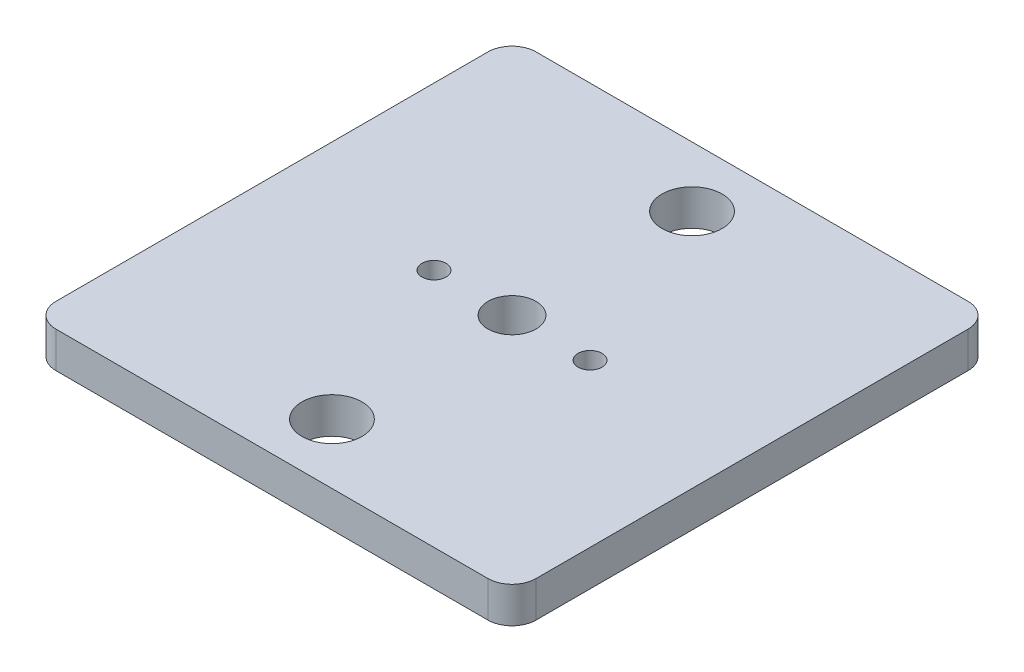
ISO-10303-21;
HEADER;
FILE_DESCRIPTION(('STEP AP214'),'2;1');
FILE_NAME('part.step','',(''),(''),'','','');
FILE_SCHEMA(('AUTOMOTIVE_DESIGN { 1 0 10303 214 1 1 1 1 }'));
ENDSEC;
DATA;
#1=APPLICATION_CONTEXT('core data for automotive mechanical design processes');
#2=APPLICATION_PROTOCOL_DEFINITION('international standard','automotive_design',2000,#1);
#3=PRODUCT_CONTEXT('',#1,'mechanical');
#4=PRODUCT('Part','Part','',(#3));
#5=PRODUCT_RELATED_PRODUCT_CATEGORY('part','',(#4));
#6=PRODUCT_DEFINITION_FORMATION('','',#4);
#7=PRODUCT_DEFINITION_CONTEXT('part definition',#1,'design');
#8=PRODUCT_DEFINITION('design','',#6,#7);
#9=PRODUCT_DEFINITION_SHAPE('','',#8);
#10=(LENGTH_UNIT() NAMED_UNIT(*) SI_UNIT(.MILLI.,.METRE.));
#11=(NAMED_UNIT(*) PLANE_ANGLE_UNIT() SI_UNIT($,.RADIAN.));
#12=(NAMED_UNIT(*) SI_UNIT($,.STERADIAN.) SOLID_ANGLE_UNIT());
#13=UNCERTAINTY_MEASURE_WITH_UNIT(LENGTH_MEASURE(1.E-05),#10,'distance_accuracy_value','');
#14=(GEOMETRIC_REPRESENTATION_CONTEXT(3) GLOBAL_UNCERTAINTY_ASSIGNED_CONTEXT((#13)) GLOBAL_UNIT_ASSIGNED_CONTEXT((#10,
#11,#12)) REPRESENTATION_CONTEXT('',''));
#15=CARTESIAN_POINT('',(0.,0.,0.));
#16=DIRECTION('',(0.,0.,1.));
#17=DIRECTION('',(1.,0.,0.));
#18=AXIS2_PLACEMENT_3D('',#15,#16,#17);
#19=CARTESIAN_POINT('',(-18.,3.,18.));
#20=DIRECTION('',(0.,-1.,0.));
#21=DIRECTION('',(0.,0.,-1.));
#22=AXIS2_PLACEMENT_3D('',#19,#20,#21);
#23=CYLINDRICAL_SURFACE('',#22,2.);
#24=CARTESIAN_POINT('',(-18.,0.,18.));
#25=DIRECTION('',(0.,1.,0.));
#26=DIRECTION('',(0.,0.,-1.));
#27=AXIS2_PLACEMENT_3D('',#24,#25,#26);
#28=CIRCLE('',#27,2.);
#29=CARTESIAN_POINT('',(-20.,0.,18.));
#30=VERTEX_POINT('',#29);
#31=CARTESIAN_POINT('',(-18.,0.,20.));
#32=VERTEX_POINT('',#31);
#33=EDGE_CURVE('E140',#30,#32,#28,.T.);
#34=ORIENTED_EDGE('',*,*,#33,.T.);
#35=DIRECTION('',(0.,-1.,0.));
#36=VECTOR('',#35,1.);
#37=CARTESIAN_POINT('',(-18.,3.,20.));
#38=LINE('',#37,#36);
#39=CARTESIAN_POINT('',(-18.,3.,20.));
#40=VERTEX_POINT('',#39);
#41=EDGE_CURVE('E11',#40,#32,#38,.T.);
#42=ORIENTED_EDGE('',*,*,#41,.F.);
#43=CARTESIAN_POINT('',(-18.,3.,18.));
#44=DIRECTION('',(0.,1.,0.));
#45=DIRECTION('',(0.,0.,-1.));
#46=AXIS2_PLACEMENT_3D('',#43,#44,#45);
#47=CIRCLE('',#46,2.);
#48=CARTESIAN_POINT('',(-20.,3.,18.));
#49=VERTEX_POINT('',#48);
#50=EDGE_CURVE('E163',#49,#40,#47,.T.);
#51=ORIENTED_EDGE('',*,*,#50,.F.);
#52=DIRECTION('',(0.,-1.,0.));
#53=VECTOR('',#52,1.);
#54=CARTESIAN_POINT('',(-20.,3.,18.));
#55=LINE('',#54,#53);
#56=EDGE_CURVE('E136',#49,#30,#55,.T.);
#57=ORIENTED_EDGE('',*,*,#56,.T.);
#58=EDGE_LOOP('',(#34,#42,#51,#57));
#59=FACE_BOUND('',#58,.T.);
#60=ADVANCED_FACE('F39',(#59),#23,.T.);
#61=CARTESIAN_POINT('',(-18.,3.,20.));
#62=DIRECTION('',(0.,0.,-1.));
#63=DIRECTION('',(-1.,0.,0.));
#64=AXIS2_PLACEMENT_3D('',#61,#62,#63);
#65=PLANE('',#64);
#66=DIRECTION('',(1.,0.,0.));
#67=VECTOR('',#66,1.);
#68=CARTESIAN_POINT('',(-18.,0.,20.));
#69=LINE('',#68,#67);
#70=CARTESIAN_POINT('',(18.,0.,20.));
#71=VERTEX_POINT('',#70);
#72=EDGE_CURVE('E144',#32,#71,#69,.T.);
#73=ORIENTED_EDGE('',*,*,#72,.T.);
#74=DIRECTION('',(0.,-1.,0.));
#75=VECTOR('',#74,1.);
#76=CARTESIAN_POINT('',(18.,3.,20.));
#77=LINE('',#76,#75);
#78=CARTESIAN_POINT('',(18.,3.,20.));
#79=VERTEX_POINT('',#78);
#80=EDGE_CURVE('E48',#79,#71,#77,.T.);
#81=ORIENTED_EDGE('',*,*,#80,.F.);
#82=DIRECTION('',(1.,0.,0.));
#83=VECTOR('',#82,1.);
#84=CARTESIAN_POINT('',(-18.,3.,20.));
#85=LINE('',#84,#83);
#86=EDGE_CURVE('E99',#40,#79,#85,.T.);
#87=ORIENTED_EDGE('',*,*,#86,.F.);
#88=ORIENTED_EDGE('',*,*,#41,.T.);
#89=EDGE_LOOP('',(#73,#81,#87,#88));
#90=FACE_BOUND('',#89,.T.);
#91=ADVANCED_FACE('F277',(#90),#65,.F.);
#92=CARTESIAN_POINT('',(18.,3.,18.));
#93=DIRECTION('',(0.,-1.,0.));
#94=DIRECTION('',(0.,0.,-1.));
#95=AXIS2_PLACEMENT_3D('',#92,#93,#94);
#96=CYLINDRICAL_SURFACE('',#95,2.);
#97=CARTESIAN_POINT('',(18.,0.,18.));
#98=DIRECTION('',(0.,1.,0.));
#99=DIRECTION('',(0.,0.,1.));
#100=AXIS2_PLACEMENT_3D('',#97,#98,#99);
#101=CIRCLE('',#100,2.);
#102=CARTESIAN_POINT('',(20.,0.,18.));
#103=VERTEX_POINT('',#102);
#104=EDGE_CURVE('E148',#71,#103,#101,.T.);
#105=ORIENTED_EDGE('',*,*,#104,.T.);
#106=DIRECTION('',(0.,-1.,0.));
#107=VECTOR('',#106,1.);
#108=CARTESIAN_POINT('',(20.,3.,18.));
#109=LINE('',#108,#107);
#110=CARTESIAN_POINT('',(20.,3.,18.));
#111=VERTEX_POINT('',#110);
#112=EDGE_CURVE('E174',#111,#103,#109,.T.);
#113=ORIENTED_EDGE('',*,*,#112,.F.);
#114=CARTESIAN_POINT('',(18.,3.,18.));
#115=DIRECTION('',(0.,1.,0.));
#116=DIRECTION('',(0.,0.,1.));
#117=AXIS2_PLACEMENT_3D('',#114,#115,#116);
#118=CIRCLE('',#117,2.);
#119=EDGE_CURVE('E184',#79,#111,#118,.T.);
#120=ORIENTED_EDGE('',*,*,#119,.F.);
#121=ORIENTED_EDGE('',*,*,#80,.T.);
#122=EDGE_LOOP('',(#105,#113,#120,#121));
#123=FACE_BOUND('',#122,.T.);
#124=ADVANCED_FACE('F182',(#123),#96,.T.);
#125=CARTESIAN_POINT('',(20.,3.,18.));
#126=DIRECTION('',(-1.,0.,0.));
#127=DIRECTION('',(0.,0.,1.));
#128=AXIS2_PLACEMENT_3D('',#125,#126,#127);
#129=PLANE('',#128);
#130=DIRECTION('',(0.,0.,-1.));
#131=VECTOR('',#130,1.);
#132=CARTESIAN_POINT('',(20.,0.,18.));
#133=LINE('',#132,#131);
#134=CARTESIAN_POINT('',(20.,0.,-18.));
#135=VERTEX_POINT('',#134);
#136=EDGE_CURVE('E151',#103,#135,#133,.T.);
#137=ORIENTED_EDGE('',*,*,#136,.T.);
#138=DIRECTION('',(0.,-1.,0.));
#139=VECTOR('',#138,1.);
#140=CARTESIAN_POINT('',(20.,3.,-18.));
#141=LINE('',#140,#139);
#142=CARTESIAN_POINT('',(20.,3.,-18.));
#143=VERTEX_POINT('',#142);
#144=EDGE_CURVE('E170',#143,#135,#141,.T.);
#145=ORIENTED_EDGE('',*,*,#144,.F.);
#146=DIRECTION('',(0.,0.,-1.));
#147=VECTOR('',#146,1.);
#148=CARTESIAN_POINT('',(20.,3.,18.));
#149=LINE('',#148,#147);
#150=EDGE_CURVE('E197',#111,#143,#149,.T.);
#151=ORIENTED_EDGE('',*,*,#150,.F.);
#152=ORIENTED_EDGE('',*,*,#112,.T.);
#153=EDGE_LOOP('',(#137,#145,#151,#152));
#154=FACE_BOUND('',#153,.T.);
#155=ADVANCED_FACE('F192',(#154),#129,.F.);
#156=CARTESIAN_POINT('',(18.,3.,-18.));
#157=DIRECTION('',(0.,-1.,0.));
#158=DIRECTION('',(0.,0.,-1.));
#159=AXIS2_PLACEMENT_3D('',#156,#157,#158);
#160=CYLINDRICAL_SURFACE('',#159,2.);
#161=CARTESIAN_POINT('',(18.,0.,-18.));
#162=DIRECTION('',(0.,1.,0.));
#163=DIRECTION('',(0.,0.,-1.));
#164=AXIS2_PLACEMENT_3D('',#161,#162,#163);
#165=CIRCLE('',#164,2.);
#166=CARTESIAN_POINT('',(18.,0.,-20.));
#167=VERTEX_POINT('',#166);
#168=EDGE_CURVE('E154',#135,#167,#165,.T.);
#169=ORIENTED_EDGE('',*,*,#168,.T.);
#170=DIRECTION('',(0.,-1.,0.));
#171=VECTOR('',#170,1.);
#172=CARTESIAN_POINT('',(18.,3.,-20.));
#173=LINE('',#172,#171);
#174=CARTESIAN_POINT('',(18.,3.,-20.));
#175=VERTEX_POINT('',#174);
#176=EDGE_CURVE('E129',#175,#167,#173,.T.);
#177=ORIENTED_EDGE('',*,*,#176,.F.);
#178=CARTESIAN_POINT('',(18.,3.,-18.));
#179=DIRECTION('',(0.,1.,0.));
#180=DIRECTION('',(0.,0.,-1.));
#181=AXIS2_PLACEMENT_3D('',#178,#179,#180);
#182=CIRCLE('',#181,2.);
#183=EDGE_CURVE('E118',#143,#175,#182,.T.);
#184=ORIENTED_EDGE('',*,*,#183,.F.);
#185=ORIENTED_EDGE('',*,*,#144,.T.);
#186=EDGE_LOOP('',(#169,#177,#184,#185));
#187=FACE_BOUND('',#186,.T.);
#188=ADVANCED_FACE('F195',(#187),#160,.T.);
#189=CARTESIAN_POINT('',(-18.,3.,-20.));
#190=DIRECTION('',(0.,0.,1.));
#191=DIRECTION('',(1.,0.,0.));
#192=AXIS2_PLACEMENT_3D('',#189,#190,#191);
#193=PLANE('',#192);
#194=DIRECTION('',(-1.,0.,0.));
#195=VECTOR('',#194,1.);
#196=CARTESIAN_POINT('',(-18.,0.,-20.));
#197=LINE('',#196,#195);
#198=CARTESIAN_POINT('',(-18.,0.,-20.));
#199=VERTEX_POINT('',#198);
#200=EDGE_CURVE('E127',#167,#199,#197,.T.);
#201=ORIENTED_EDGE('',*,*,#200,.T.);
#202=DIRECTION('',(0.,-1.,0.));
#203=VECTOR('',#202,1.);
#204=CARTESIAN_POINT('',(-18.,3.,-20.));
#205=LINE('',#204,#203);
#206=CARTESIAN_POINT('',(-18.,3.,-20.));
#207=VERTEX_POINT('',#206);
#208=EDGE_CURVE('E124',#207,#199,#205,.T.);
#209=ORIENTED_EDGE('',*,*,#208,.F.);
#210=DIRECTION('',(-1.,0.,0.));
#211=VECTOR('',#210,1.);
#212=CARTESIAN_POINT('',(-18.,3.,-20.));
#213=LINE('',#212,#211);
#214=EDGE_CURVE('E112',#175,#207,#213,.T.);
#215=ORIENTED_EDGE('',*,*,#214,.F.);
#216=ORIENTED_EDGE('',*,*,#176,.T.);
#217=EDGE_LOOP('',(#201,#209,#215,#216));
#218=FACE_BOUND('',#217,.T.);
#219=ADVANCED_FACE('F125',(#218),#193,.F.);
#220=CARTESIAN_POINT('',(-18.,3.,-18.));
#221=DIRECTION('',(0.,-1.,0.));
#222=DIRECTION('',(0.,0.,-1.));
#223=AXIS2_PLACEMENT_3D('',#220,#221,#222);
#224=CYLINDRICAL_SURFACE('',#223,2.);
#225=CARTESIAN_POINT('',(-18.,0.,-18.));
#226=DIRECTION('',(0.,1.,0.));
#227=DIRECTION('',(0.,0.,-1.));
#228=AXIS2_PLACEMENT_3D('',#225,#226,#227);
#229=CIRCLE('',#228,2.);
#230=CARTESIAN_POINT('',(-20.,0.,-18.));
#231=VERTEX_POINT('',#230);
#232=EDGE_CURVE('E85',#199,#231,#229,.T.);
#233=ORIENTED_EDGE('',*,*,#232,.T.);
#234=DIRECTION('',(0.,-1.,0.));
#235=VECTOR('',#234,1.);
#236=CARTESIAN_POINT('',(-20.,3.,-18.));
#237=LINE('',#236,#235);
#238=CARTESIAN_POINT('',(-20.,3.,-18.));
#239=VERTEX_POINT('',#238);
#240=EDGE_CURVE('E130',#239,#231,#237,.T.);
#241=ORIENTED_EDGE('',*,*,#240,.F.);
#242=CARTESIAN_POINT('',(-18.,3.,-18.));
#243=DIRECTION('',(0.,1.,0.));
#244=DIRECTION('',(0.,0.,-1.));
#245=AXIS2_PLACEMENT_3D('',#242,#243,#244);
#246=CIRCLE('',#245,2.);
#247=EDGE_CURVE('E116',#207,#239,#246,.T.);
#248=ORIENTED_EDGE('',*,*,#247,.F.);
#249=ORIENTED_EDGE('',*,*,#208,.T.);
#250=EDGE_LOOP('',(#233,#241,#248,#249));
#251=FACE_BOUND('',#250,.T.);
#252=ADVANCED_FACE('F132',(#251),#224,.T.);
#253=CARTESIAN_POINT('',(-20.,3.,18.));
#254=DIRECTION('',(1.,0.,0.));
#255=DIRECTION('',(0.,0.,-1.));
#256=AXIS2_PLACEMENT_3D('',#253,#254,#255);
#257=PLANE('',#256);
#258=DIRECTION('',(0.,0.,1.));
#259=VECTOR('',#258,1.);
#260=CARTESIAN_POINT('',(-20.,0.,18.));
#261=LINE('',#260,#259);
#262=EDGE_CURVE('E91',#231,#30,#261,.T.);
#263=ORIENTED_EDGE('',*,*,#262,.T.);
#264=ORIENTED_EDGE('',*,*,#56,.F.);
#265=DIRECTION('',(0.,0.,1.));
#266=VECTOR('',#265,1.);
#267=CARTESIAN_POINT('',(-20.,3.,18.));
#268=LINE('',#267,#266);
#269=EDGE_CURVE('E56',#239,#49,#268,.T.);
#270=ORIENTED_EDGE('',*,*,#269,.F.);
#271=ORIENTED_EDGE('',*,*,#240,.T.);
#272=EDGE_LOOP('',(#263,#264,#270,#271));
#273=FACE_BOUND('',#272,.T.);
#274=ADVANCED_FACE('F252',(#273),#257,.F.);
#275=CARTESIAN_POINT('',(-18.,3.,18.));
#276=DIRECTION('',(0.,-1.,0.));
#277=DIRECTION('',(0.,0.,-1.));
#278=AXIS2_PLACEMENT_3D('',#275,#276,#277);
#279=PLANE('',#278);
#280=CARTESIAN_POINT('',(6.5,3.,0.));
#281=DIRECTION('',(0.,1.,0.));
#282=DIRECTION('',(0.,0.,1.));
#283=AXIS2_PLACEMENT_3D('',#280,#281,#282);
#284=CIRCLE('',#283,1.);
#285=CARTESIAN_POINT('',(6.5,3.,1.));
#286=VERTEX_POINT('',#285);
#287=EDGE_CURVE('E220',#286,#286,#284,.T.);
#288=ORIENTED_EDGE('',*,*,#287,.F.);
#289=EDGE_LOOP('',(#288));
#290=FACE_BOUND('',#289,.T.);
#291=CARTESIAN_POINT('',(-6.5,3.,0.));
#292=DIRECTION('',(0.,1.,0.));
#293=DIRECTION('',(0.,0.,1.));
#294=AXIS2_PLACEMENT_3D('',#291,#292,#293);
#295=CIRCLE('',#294,1.);
#296=CARTESIAN_POINT('',(-6.5,3.,1.));
#297=VERTEX_POINT('',#296);
#298=EDGE_CURVE('E235',#297,#297,#295,.T.);
#299=ORIENTED_EDGE('',*,*,#298,.F.);
#300=EDGE_LOOP('',(#299));
#301=FACE_BOUND('',#300,.T.);
#302=CARTESIAN_POINT('',(0.,3.,15.));
#303=DIRECTION('',(0.,1.,0.));
#304=DIRECTION('',(0.,0.,1.));
#305=AXIS2_PLACEMENT_3D('',#302,#303,#304);
#306=CIRCLE('',#305,2.5);
#307=CARTESIAN_POINT('',(0.,3.,17.5));
#308=VERTEX_POINT('',#307);
#309=EDGE_CURVE('E219',#308,#308,#306,.T.);
#310=ORIENTED_EDGE('',*,*,#309,.F.);
#311=EDGE_LOOP('',(#310));
#312=FACE_BOUND('',#311,.T.);
#313=CARTESIAN_POINT('',(0.,3.,-15.));
#314=DIRECTION('',(0.,1.,0.));
#315=DIRECTION('',(0.,0.,1.));
#316=AXIS2_PLACEMENT_3D('',#313,#314,#315);
#317=CIRCLE('',#316,2.5);
#318=CARTESIAN_POINT('',(0.,3.,-12.5));
#319=VERTEX_POINT('',#318);
#320=EDGE_CURVE('E211',#319,#319,#317,.T.);
#321=ORIENTED_EDGE('',*,*,#320,.F.);
#322=EDGE_LOOP('',(#321));
#323=FACE_BOUND('',#322,.T.);
#324=CARTESIAN_POINT('',(0.,3.,0.));
#325=DIRECTION('',(0.,1.,0.));
#326=DIRECTION('',(0.,0.,1.));
#327=AXIS2_PLACEMENT_3D('',#324,#325,#326);
#328=CIRCLE('',#327,2.);
#329=CARTESIAN_POINT('',(0.,3.,2.));
#330=VERTEX_POINT('',#329);
#331=EDGE_CURVE('E145',#330,#330,#328,.T.);
#332=ORIENTED_EDGE('',*,*,#331,.F.);
#333=EDGE_LOOP('',(#332));
#334=FACE_BOUND('',#333,.T.);
#335=ORIENTED_EDGE('',*,*,#50,.T.);
#336=ORIENTED_EDGE('',*,*,#86,.T.);
#337=ORIENTED_EDGE('',*,*,#119,.T.);
#338=ORIENTED_EDGE('',*,*,#150,.T.);
#339=ORIENTED_EDGE('',*,*,#183,.T.);
#340=ORIENTED_EDGE('',*,*,#214,.T.);
#341=ORIENTED_EDGE('',*,*,#247,.T.);
#342=ORIENTED_EDGE('',*,*,#269,.T.);
#343=EDGE_LOOP('',(#335,#336,#337,#338,#339,#340,#341,#342));
#344=FACE_BOUND('',#343,.T.);
#345=ADVANCED_FACE('F114',(#290,#301,#312,#323,#334,#344),#279,.F.);
#346=CARTESIAN_POINT('',(-18.,0.,18.));
#347=DIRECTION('',(0.,-1.,0.));
#348=DIRECTION('',(0.,0.,-1.));
#349=AXIS2_PLACEMENT_3D('',#346,#347,#348);
#350=PLANE('',#349);
#351=CARTESIAN_POINT('',(6.5,0.,0.));
#352=DIRECTION('',(0.,1.,0.));
#353=DIRECTION('',(0.,0.,1.));
#354=AXIS2_PLACEMENT_3D('',#351,#352,#353);
#355=CIRCLE('',#354,1.);
#356=CARTESIAN_POINT('',(6.5,0.,1.));
#357=VERTEX_POINT('',#356);
#358=EDGE_CURVE('E239',#357,#357,#355,.T.);
#359=ORIENTED_EDGE('',*,*,#358,.T.);
#360=EDGE_LOOP('',(#359));
#361=FACE_BOUND('',#360,.T.);
#362=CARTESIAN_POINT('',(-6.5,0.,0.));
#363=DIRECTION('',(0.,1.,0.));
#364=DIRECTION('',(0.,0.,1.));
#365=AXIS2_PLACEMENT_3D('',#362,#363,#364);
#366=CIRCLE('',#365,1.);
#367=CARTESIAN_POINT('',(-6.5,0.,1.));
#368=VERTEX_POINT('',#367);
#369=EDGE_CURVE('E231',#368,#368,#366,.T.);
#370=ORIENTED_EDGE('',*,*,#369,.T.);
#371=EDGE_LOOP('',(#370));
#372=FACE_BOUND('',#371,.T.);
#373=CARTESIAN_POINT('',(0.,0.,15.));
#374=DIRECTION('',(0.,1.,0.));
#375=DIRECTION('',(0.,0.,1.));
#376=AXIS2_PLACEMENT_3D('',#373,#374,#375);
#377=CIRCLE('',#376,2.5);
#378=CARTESIAN_POINT('',(0.,0.,17.5));
#379=VERTEX_POINT('',#378);
#380=EDGE_CURVE('E215',#379,#379,#377,.T.);
#381=ORIENTED_EDGE('',*,*,#380,.T.);
#382=EDGE_LOOP('',(#381));
#383=FACE_BOUND('',#382,.T.);
#384=CARTESIAN_POINT('',(0.,0.,-15.));
#385=DIRECTION('',(0.,1.,0.));
#386=DIRECTION('',(0.,0.,1.));
#387=AXIS2_PLACEMENT_3D('',#384,#385,#386);
#388=CIRCLE('',#387,2.5);
#389=CARTESIAN_POINT('',(0.,0.,-12.5));
#390=VERTEX_POINT('',#389);
#391=EDGE_CURVE('E224',#390,#390,#388,.T.);
#392=ORIENTED_EDGE('',*,*,#391,.T.);
#393=EDGE_LOOP('',(#392));
#394=FACE_BOUND('',#393,.T.);
#395=CARTESIAN_POINT('',(0.,0.,0.));
#396=DIRECTION('',(0.,1.,0.));
#397=DIRECTION('',(0.,0.,1.));
#398=AXIS2_PLACEMENT_3D('',#395,#396,#397);
#399=CIRCLE('',#398,2.);
#400=CARTESIAN_POINT('',(0.,0.,2.));
#401=VERTEX_POINT('',#400);
#402=EDGE_CURVE('E207',#401,#401,#399,.T.);
#403=ORIENTED_EDGE('',*,*,#402,.T.);
#404=EDGE_LOOP('',(#403));
#405=FACE_BOUND('',#404,.T.);
#406=ORIENTED_EDGE('',*,*,#33,.F.);
#407=ORIENTED_EDGE('',*,*,#262,.F.);
#408=ORIENTED_EDGE('',*,*,#232,.F.);
#409=ORIENTED_EDGE('',*,*,#200,.F.);
#410=ORIENTED_EDGE('',*,*,#168,.F.);
#411=ORIENTED_EDGE('',*,*,#136,.F.);
#412=ORIENTED_EDGE('',*,*,#104,.F.);
#413=ORIENTED_EDGE('',*,*,#72,.F.);
#414=EDGE_LOOP('',(#406,#407,#408,#409,#410,#411,#412,#413));
#415=FACE_BOUND('',#414,.T.);
#416=ADVANCED_FACE('F188',(#361,#372,#383,#394,#405,#415),#350,.T.);
#417=CARTESIAN_POINT('',(0.,3.,0.));
#418=DIRECTION('',(0.,-1.,0.));
#419=DIRECTION('',(0.,0.,-1.));
#420=AXIS2_PLACEMENT_3D('',#417,#418,#419);
#421=CYLINDRICAL_SURFACE('',#420,2.);
#422=ORIENTED_EDGE('',*,*,#331,.T.);
#423=EDGE_LOOP('',(#422));
#424=FACE_BOUND('',#423,.T.);
#425=ORIENTED_EDGE('',*,*,#402,.F.);
#426=EDGE_LOOP('',(#425));
#427=FACE_BOUND('',#426,.T.);
#428=ADVANCED_FACE('F262',(#424,#427),#421,.F.);
#429=CARTESIAN_POINT('',(0.,3.,-15.));
#430=DIRECTION('',(0.,-1.,0.));
#431=DIRECTION('',(0.,0.,-1.));
#432=AXIS2_PLACEMENT_3D('',#429,#430,#431);
#433=CYLINDRICAL_SURFACE('',#432,2.5);
#434=ORIENTED_EDGE('',*,*,#320,.T.);
#435=EDGE_LOOP('',(#434));
#436=FACE_BOUND('',#435,.T.);
#437=ORIENTED_EDGE('',*,*,#391,.F.);
#438=EDGE_LOOP('',(#437));
#439=FACE_BOUND('',#438,.T.);
#440=ADVANCED_FACE('F265',(#436,#439),#433,.F.);
#441=CARTESIAN_POINT('',(0.,3.,15.));
#442=DIRECTION('',(0.,-1.,0.));
#443=DIRECTION('',(0.,0.,-1.));
#444=AXIS2_PLACEMENT_3D('',#441,#442,#443);
#445=CYLINDRICAL_SURFACE('',#444,2.5);
#446=ORIENTED_EDGE('',*,*,#309,.T.);
#447=EDGE_LOOP('',(#446));
#448=FACE_BOUND('',#447,.T.);
#449=ORIENTED_EDGE('',*,*,#380,.F.);
#450=EDGE_LOOP('',(#449));
#451=FACE_BOUND('',#450,.T.);
#452=ADVANCED_FACE('F338',(#448,#451),#445,.F.);
#453=CARTESIAN_POINT('',(-6.5,3.,0.));
#454=DIRECTION('',(0.,-1.,0.));
#455=DIRECTION('',(0.,0.,-1.));
#456=AXIS2_PLACEMENT_3D('',#453,#454,#455);
#457=CYLINDRICAL_SURFACE('',#456,1.);
#458=ORIENTED_EDGE('',*,*,#298,.T.);
#459=EDGE_LOOP('',(#458));
#460=FACE_BOUND('',#459,.T.);
#461=ORIENTED_EDGE('',*,*,#369,.F.);
#462=EDGE_LOOP('',(#461));
#463=FACE_BOUND('',#462,.T.);
#464=ADVANCED_FACE('F348',(#460,#463),#457,.F.);
#465=CARTESIAN_POINT('',(6.5,3.,0.));
#466=DIRECTION('',(0.,-1.,0.));
#467=DIRECTION('',(0.,0.,-1.));
#468=AXIS2_PLACEMENT_3D('',#465,#466,#467);
#469=CYLINDRICAL_SURFACE('',#468,1.);
#470=ORIENTED_EDGE('',*,*,#287,.T.);
#471=EDGE_LOOP('',(#470));
#472=FACE_BOUND('',#471,.T.);
#473=ORIENTED_EDGE('',*,*,#358,.F.);
#474=EDGE_LOOP('',(#473));
#475=FACE_BOUND('',#474,.T.);
#476=ADVANCED_FACE('F247',(#472,#475),#469,.F.);
#477=CLOSED_SHELL('',(#60,#91,#124,#155,#188,#219,#252,#274,#345,#416,#428,#440,#452,#464,#476));
#478=MANIFOLD_SOLID_BREP('B2',#477);
#479=ADVANCED_BREP_SHAPE_REPRESENTATION('',(#18,#478),#14);
#480=SHAPE_DEFINITION_REPRESENTATION(#9,#479);
ENDSEC;
END-ISO-10303-21;
